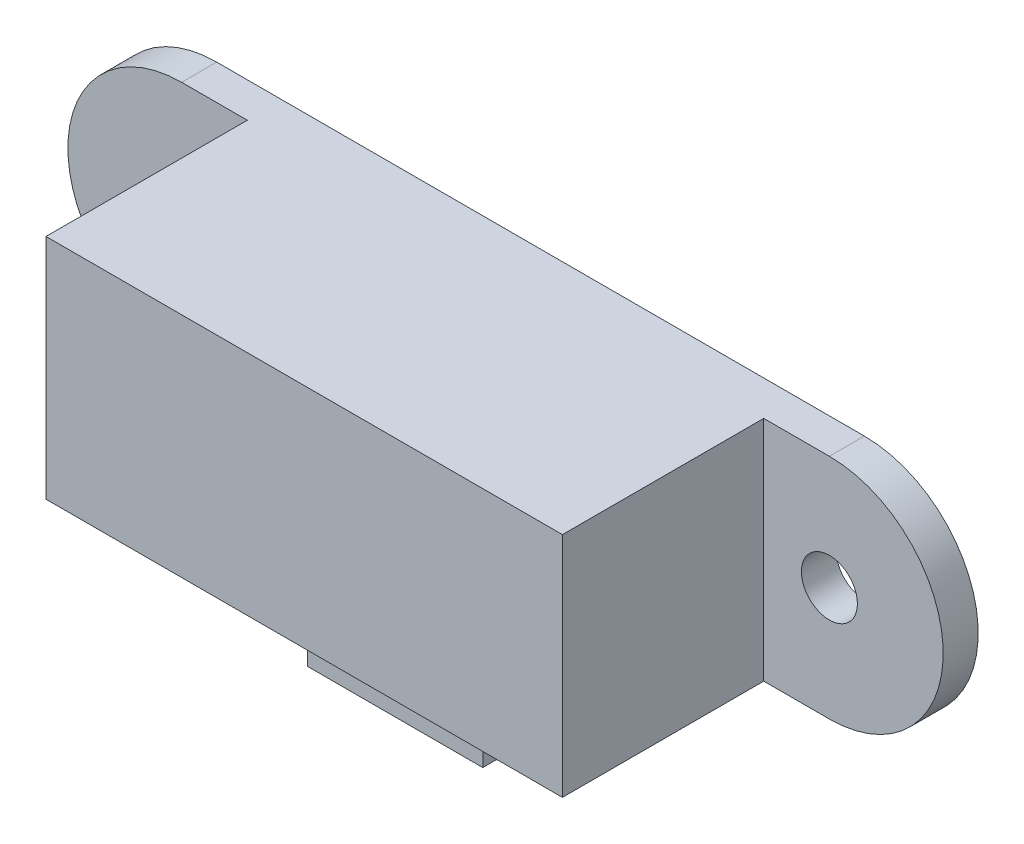
ISO-10303-21;
HEADER;
FILE_DESCRIPTION(('STEP AP214'),'2;1');
FILE_NAME('part.step','',(''),(''),'','','');
FILE_SCHEMA(('AUTOMOTIVE_DESIGN { 1 0 10303 214 1 1 1 1 }'));
ENDSEC;
DATA;
#1=APPLICATION_CONTEXT('core data for automotive mechanical design processes');
#2=APPLICATION_PROTOCOL_DEFINITION('international standard','automotive_design',2000,#1);
#3=PRODUCT_CONTEXT('',#1,'mechanical');
#4=PRODUCT('Part','Part','',(#3));
#5=PRODUCT_RELATED_PRODUCT_CATEGORY('part','',(#4));
#6=PRODUCT_DEFINITION_FORMATION('','',#4);
#7=PRODUCT_DEFINITION_CONTEXT('part definition',#1,'design');
#8=PRODUCT_DEFINITION('design','',#6,#7);
#9=PRODUCT_DEFINITION_SHAPE('','',#8);
#10=(LENGTH_UNIT() NAMED_UNIT(*) SI_UNIT(.MILLI.,.METRE.));
#11=(NAMED_UNIT(*) PLANE_ANGLE_UNIT() SI_UNIT($,.RADIAN.));
#12=(NAMED_UNIT(*) SI_UNIT($,.STERADIAN.) SOLID_ANGLE_UNIT());
#13=UNCERTAINTY_MEASURE_WITH_UNIT(LENGTH_MEASURE(1.E-05),#10,'distance_accuracy_value','');
#14=(GEOMETRIC_REPRESENTATION_CONTEXT(3) GLOBAL_UNCERTAINTY_ASSIGNED_CONTEXT((#13)) GLOBAL_UNIT_ASSIGNED_CONTEXT((#10,
#11,#12)) REPRESENTATION_CONTEXT('',''));
#15=CARTESIAN_POINT('',(0.,0.,0.));
#16=DIRECTION('',(0.,0.,1.));
#17=DIRECTION('',(1.,0.,0.));
#18=AXIS2_PLACEMENT_3D('',#15,#16,#17);
#19=CARTESIAN_POINT('',(-18.5,-6.5,2.));
#20=DIRECTION('',(0.,1.,0.));
#21=DIRECTION('',(0.,0.,1.));
#22=AXIS2_PLACEMENT_3D('',#19,#20,#21);
#23=PLANE('',#22);
#24=DIRECTION('',(1.,0.,0.));
#25=VECTOR('',#24,1.);
#26=CARTESIAN_POINT('',(-18.5,-6.5,0.));
#27=LINE('',#26,#25);
#28=CARTESIAN_POINT('',(-18.5,-6.5,0.));
#29=VERTEX_POINT('',#28);
#30=CARTESIAN_POINT('',(18.5,-6.5,0.));
#31=VERTEX_POINT('',#30);
#32=EDGE_CURVE('E238',#29,#31,#27,.T.);
#33=ORIENTED_EDGE('',*,*,#32,.T.);
#34=DIRECTION('',(0.,0.,-1.));
#35=VECTOR('',#34,1.);
#36=CARTESIAN_POINT('',(18.5,-6.5,2.));
#37=LINE('',#36,#35);
#38=CARTESIAN_POINT('',(18.5,-6.5,2.));
#39=VERTEX_POINT('',#38);
#40=EDGE_CURVE('E43',#39,#31,#37,.T.);
#41=ORIENTED_EDGE('',*,*,#40,.F.);
#42=DIRECTION('',(1.,0.,0.));
#43=VECTOR('',#42,1.);
#44=CARTESIAN_POINT('',(-18.5,-6.5,2.));
#45=LINE('',#44,#43);
#46=CARTESIAN_POINT('',(14.75,-6.5,2.));
#47=VERTEX_POINT('',#46);
#48=EDGE_CURVE('E214',#47,#39,#45,.T.);
#49=ORIENTED_EDGE('',*,*,#48,.F.);
#50=DIRECTION('',(0.,0.,-1.));
#51=VECTOR('',#50,1.);
#52=CARTESIAN_POINT('',(14.75,-6.5,13.5));
#53=LINE('',#52,#51);
#54=CARTESIAN_POINT('',(14.75,-6.5,13.5));
#55=VERTEX_POINT('',#54);
#56=EDGE_CURVE('E178',#55,#47,#53,.T.);
#57=ORIENTED_EDGE('',*,*,#56,.F.);
#58=DIRECTION('',(1.,0.,0.));
#59=VECTOR('',#58,1.);
#60=CARTESIAN_POINT('',(-14.75,-6.5,13.5));
#61=LINE('',#60,#59);
#62=CARTESIAN_POINT('',(-14.75,-6.5,13.5));
#63=VERTEX_POINT('',#62);
#64=EDGE_CURVE('E158',#63,#55,#61,.T.);
#65=ORIENTED_EDGE('',*,*,#64,.F.);
#66=DIRECTION('',(0.,0.,-1.));
#67=VECTOR('',#66,1.);
#68=CARTESIAN_POINT('',(-14.75,-6.5,13.5));
#69=LINE('',#68,#67);
#70=CARTESIAN_POINT('',(-14.75,-6.5,2.));
#71=VERTEX_POINT('',#70);
#72=EDGE_CURVE('E185',#63,#71,#69,.T.);
#73=ORIENTED_EDGE('',*,*,#72,.T.);
#74=CARTESIAN_POINT('',(-18.5,-6.5,2.));
#75=VERTEX_POINT('',#74);
#76=EDGE_CURVE('E224',#75,#71,#45,.T.);
#77=ORIENTED_EDGE('',*,*,#76,.F.);
#78=DIRECTION('',(0.,0.,-1.));
#79=VECTOR('',#78,1.);
#80=CARTESIAN_POINT('',(-18.5,-6.5,2.));
#81=LINE('',#80,#79);
#82=EDGE_CURVE('E11',#75,#29,#81,.T.);
#83=ORIENTED_EDGE('',*,*,#82,.T.);
#84=EDGE_LOOP('',(#33,#41,#49,#57,#65,#73,#77,#83));
#85=FACE_BOUND('',#84,.T.);
#86=DIRECTION('',(0.,0.,-1.));
#87=VECTOR('',#86,1.);
#88=CARTESIAN_POINT('',(-5.,-6.5,8.3));
#89=LINE('',#88,#87);
#90=CARTESIAN_POINT('',(-5.,-6.5,8.3));
#91=VERTEX_POINT('',#90);
#92=CARTESIAN_POINT('',(-5.,-6.5,3.3));
#93=VERTEX_POINT('',#92);
#94=EDGE_CURVE('E145',#91,#93,#89,.T.);
#95=ORIENTED_EDGE('',*,*,#94,.F.);
#96=DIRECTION('',(-1.,0.,0.));
#97=VECTOR('',#96,1.);
#98=CARTESIAN_POINT('',(-5.,-6.5,8.3));
#99=LINE('',#98,#97);
#100=CARTESIAN_POINT('',(5.,-6.5,8.3));
#101=VERTEX_POINT('',#100);
#102=EDGE_CURVE('E142',#101,#91,#99,.T.);
#103=ORIENTED_EDGE('',*,*,#102,.F.);
#104=DIRECTION('',(0.,0.,1.));
#105=VECTOR('',#104,1.);
#106=CARTESIAN_POINT('',(5.,-6.5,8.3));
#107=LINE('',#106,#105);
#108=CARTESIAN_POINT('',(5.,-6.5,3.3));
#109=VERTEX_POINT('',#108);
#110=EDGE_CURVE('E56',#109,#101,#107,.T.);
#111=ORIENTED_EDGE('',*,*,#110,.F.);
#112=DIRECTION('',(1.,0.,0.));
#113=VECTOR('',#112,1.);
#114=CARTESIAN_POINT('',(-5.,-6.5,3.3));
#115=LINE('',#114,#113);
#116=EDGE_CURVE('E51',#93,#109,#115,.T.);
#117=ORIENTED_EDGE('',*,*,#116,.F.);
#118=EDGE_LOOP('',(#95,#103,#111,#117));
#119=FACE_BOUND('',#118,.T.);
#120=ADVANCED_FACE('F34',(#85,#119),#23,.F.);
#121=CARTESIAN_POINT('',(-18.5,0.,2.));
#122=DIRECTION('',(0.,0.,1.));
#123=DIRECTION('',(1.,0.,0.));
#124=AXIS2_PLACEMENT_3D('',#121,#122,#123);
#125=PLANE('',#124);
#126=DIRECTION('',(0.,-1.,0.));
#127=VECTOR('',#126,1.);
#128=CARTESIAN_POINT('',(-14.75,6.5,2.));
#129=LINE('',#128,#127);
#130=CARTESIAN_POINT('',(-14.75,6.5,2.));
#131=VERTEX_POINT('',#130);
#132=EDGE_CURVE('E146',#131,#71,#129,.T.);
#133=ORIENTED_EDGE('',*,*,#132,.F.);
#134=DIRECTION('',(-1.,0.,0.));
#135=VECTOR('',#134,1.);
#136=CARTESIAN_POINT('',(18.5,6.5,2.));
#137=LINE('',#136,#135);
#138=CARTESIAN_POINT('',(-18.5,6.5,2.));
#139=VERTEX_POINT('',#138);
#140=EDGE_CURVE('E243',#131,#139,#137,.T.);
#141=ORIENTED_EDGE('',*,*,#140,.T.);
#142=CARTESIAN_POINT('',(-18.5,0.,2.));
#143=DIRECTION('',(0.,0.,1.));
#144=DIRECTION('',(1.,0.,0.));
#145=AXIS2_PLACEMENT_3D('',#142,#143,#144);
#146=CIRCLE('',#145,6.5);
#147=EDGE_CURVE('E211',#139,#75,#146,.T.);
#148=ORIENTED_EDGE('',*,*,#147,.T.);
#149=ORIENTED_EDGE('',*,*,#76,.T.);
#150=EDGE_LOOP('',(#133,#141,#148,#149));
#151=FACE_BOUND('',#150,.T.);
#152=CARTESIAN_POINT('',(-18.5,0.,2.));
#153=DIRECTION('',(0.,0.,1.));
#154=DIRECTION('',(1.,0.,0.));
#155=AXIS2_PLACEMENT_3D('',#152,#153,#154);
#156=CIRCLE('',#155,1.6);
#157=CARTESIAN_POINT('',(-16.9,0.,2.));
#158=VERTEX_POINT('',#157);
#159=EDGE_CURVE('E205',#158,#158,#156,.T.);
#160=ORIENTED_EDGE('',*,*,#159,.F.);
#161=EDGE_LOOP('',(#160));
#162=FACE_BOUND('',#161,.T.);
#163=ADVANCED_FACE('F273',(#151,#162),#125,.T.);
#164=DIRECTION('',(0.,1.,0.));
#165=VECTOR('',#164,1.);
#166=CARTESIAN_POINT('',(14.75,6.5,2.));
#167=LINE('',#166,#165);
#168=CARTESIAN_POINT('',(14.75,6.5,2.));
#169=VERTEX_POINT('',#168);
#170=EDGE_CURVE('E149',#47,#169,#167,.T.);
#171=ORIENTED_EDGE('',*,*,#170,.F.);
#172=ORIENTED_EDGE('',*,*,#48,.T.);
#173=CARTESIAN_POINT('',(18.5,0.,2.));
#174=DIRECTION('',(0.,0.,1.));
#175=DIRECTION('',(-1.,0.,0.));
#176=AXIS2_PLACEMENT_3D('',#173,#174,#175);
#177=CIRCLE('',#176,6.5);
#178=CARTESIAN_POINT('',(18.5,6.5,2.));
#179=VERTEX_POINT('',#178);
#180=EDGE_CURVE('E218',#39,#179,#177,.T.);
#181=ORIENTED_EDGE('',*,*,#180,.T.);
#182=EDGE_CURVE('E234',#179,#169,#137,.T.);
#183=ORIENTED_EDGE('',*,*,#182,.T.);
#184=EDGE_LOOP('',(#171,#172,#181,#183));
#185=FACE_BOUND('',#184,.T.);
#186=CARTESIAN_POINT('',(18.5,0.,2.));
#187=DIRECTION('',(0.,0.,1.));
#188=DIRECTION('',(1.,0.,0.));
#189=AXIS2_PLACEMENT_3D('',#186,#187,#188);
#190=CIRCLE('',#189,1.6);
#191=CARTESIAN_POINT('',(20.1,0.,2.));
#192=VERTEX_POINT('',#191);
#193=EDGE_CURVE('E198',#192,#192,#190,.T.);
#194=ORIENTED_EDGE('',*,*,#193,.F.);
#195=EDGE_LOOP('',(#194));
#196=FACE_BOUND('',#195,.T.);
#197=ADVANCED_FACE('F251',(#185,#196),#125,.T.);
#198=CARTESIAN_POINT('',(-18.5,0.,0.));
#199=DIRECTION('',(0.,0.,1.));
#200=DIRECTION('',(1.,0.,0.));
#201=AXIS2_PLACEMENT_3D('',#198,#199,#200);
#202=PLANE('',#201);
#203=CARTESIAN_POINT('',(-18.5,0.,0.));
#204=DIRECTION('',(0.,0.,1.));
#205=DIRECTION('',(1.,0.,0.));
#206=AXIS2_PLACEMENT_3D('',#203,#204,#205);
#207=CIRCLE('',#206,1.6);
#208=CARTESIAN_POINT('',(-16.9,0.,0.));
#209=VERTEX_POINT('',#208);
#210=EDGE_CURVE('E203',#209,#209,#207,.T.);
#211=ORIENTED_EDGE('',*,*,#210,.T.);
#212=EDGE_LOOP('',(#211));
#213=FACE_BOUND('',#212,.T.);
#214=CARTESIAN_POINT('',(-18.5,0.,0.));
#215=DIRECTION('',(0.,0.,1.));
#216=DIRECTION('',(1.,0.,0.));
#217=AXIS2_PLACEMENT_3D('',#214,#215,#216);
#218=CIRCLE('',#217,6.5);
#219=CARTESIAN_POINT('',(-18.5,6.5,0.));
#220=VERTEX_POINT('',#219);
#221=EDGE_CURVE('E208',#220,#29,#218,.T.);
#222=ORIENTED_EDGE('',*,*,#221,.F.);
#223=DIRECTION('',(-1.,0.,0.));
#224=VECTOR('',#223,1.);
#225=CARTESIAN_POINT('',(18.5,6.5,0.));
#226=LINE('',#225,#224);
#227=CARTESIAN_POINT('',(18.5,6.5,0.));
#228=VERTEX_POINT('',#227);
#229=EDGE_CURVE('E215',#228,#220,#226,.T.);
#230=ORIENTED_EDGE('',*,*,#229,.F.);
#231=CARTESIAN_POINT('',(18.5,0.,0.));
#232=DIRECTION('',(0.,0.,1.));
#233=DIRECTION('',(-1.,0.,0.));
#234=AXIS2_PLACEMENT_3D('',#231,#232,#233);
#235=CIRCLE('',#234,6.5);
#236=EDGE_CURVE('E236',#31,#228,#235,.T.);
#237=ORIENTED_EDGE('',*,*,#236,.F.);
#238=ORIENTED_EDGE('',*,*,#32,.F.);
#239=EDGE_LOOP('',(#222,#230,#237,#238));
#240=FACE_BOUND('',#239,.T.);
#241=CARTESIAN_POINT('',(18.5,0.,0.));
#242=DIRECTION('',(0.,0.,1.));
#243=DIRECTION('',(1.,0.,0.));
#244=AXIS2_PLACEMENT_3D('',#241,#242,#243);
#245=CIRCLE('',#244,1.6);
#246=CARTESIAN_POINT('',(20.1,0.,0.));
#247=VERTEX_POINT('',#246);
#248=EDGE_CURVE('E194',#247,#247,#245,.T.);
#249=ORIENTED_EDGE('',*,*,#248,.T.);
#250=EDGE_LOOP('',(#249));
#251=FACE_BOUND('',#250,.T.);
#252=ADVANCED_FACE('F319',(#213,#240,#251),#202,.F.);
#253=CARTESIAN_POINT('',(-18.5,0.,2.));
#254=DIRECTION('',(0.,0.,-1.));
#255=DIRECTION('',(-1.,0.,0.));
#256=AXIS2_PLACEMENT_3D('',#253,#254,#255);
#257=CYLINDRICAL_SURFACE('',#256,6.5);
#258=ORIENTED_EDGE('',*,*,#221,.T.);
#259=ORIENTED_EDGE('',*,*,#82,.F.);
#260=ORIENTED_EDGE('',*,*,#147,.F.);
#261=DIRECTION('',(0.,0.,-1.));
#262=VECTOR('',#261,1.);
#263=CARTESIAN_POINT('',(-18.5,6.5,2.));
#264=LINE('',#263,#262);
#265=EDGE_CURVE('E231',#139,#220,#264,.T.);
#266=ORIENTED_EDGE('',*,*,#265,.T.);
#267=EDGE_LOOP('',(#258,#259,#260,#266));
#268=FACE_BOUND('',#267,.T.);
#269=ADVANCED_FACE('F36',(#268),#257,.T.);
#270=CARTESIAN_POINT('',(18.5,0.,2.));
#271=DIRECTION('',(0.,0.,-1.));
#272=DIRECTION('',(-1.,0.,0.));
#273=AXIS2_PLACEMENT_3D('',#270,#271,#272);
#274=CYLINDRICAL_SURFACE('',#273,6.5);
#275=ORIENTED_EDGE('',*,*,#236,.T.);
#276=DIRECTION('',(0.,0.,-1.));
#277=VECTOR('',#276,1.);
#278=CARTESIAN_POINT('',(18.5,6.5,2.));
#279=LINE('',#278,#277);
#280=EDGE_CURVE('E228',#179,#228,#279,.T.);
#281=ORIENTED_EDGE('',*,*,#280,.F.);
#282=ORIENTED_EDGE('',*,*,#180,.F.);
#283=ORIENTED_EDGE('',*,*,#40,.T.);
#284=EDGE_LOOP('',(#275,#281,#282,#283));
#285=FACE_BOUND('',#284,.T.);
#286=ADVANCED_FACE('F256',(#285),#274,.T.);
#287=CARTESIAN_POINT('',(18.5,6.5,2.));
#288=DIRECTION('',(0.,-1.,0.));
#289=DIRECTION('',(0.,0.,-1.));
#290=AXIS2_PLACEMENT_3D('',#287,#288,#289);
#291=PLANE('',#290);
#292=ORIENTED_EDGE('',*,*,#229,.T.);
#293=ORIENTED_EDGE('',*,*,#265,.F.);
#294=ORIENTED_EDGE('',*,*,#140,.F.);
#295=DIRECTION('',(0.,0.,-1.));
#296=VECTOR('',#295,1.);
#297=CARTESIAN_POINT('',(-14.75,6.5,13.5));
#298=LINE('',#297,#296);
#299=CARTESIAN_POINT('',(-14.75,6.5,13.5));
#300=VERTEX_POINT('',#299);
#301=EDGE_CURVE('E164',#300,#131,#298,.T.);
#302=ORIENTED_EDGE('',*,*,#301,.F.);
#303=DIRECTION('',(-1.,0.,0.));
#304=VECTOR('',#303,1.);
#305=CARTESIAN_POINT('',(-14.75,6.5,13.5));
#306=LINE('',#305,#304);
#307=CARTESIAN_POINT('',(14.75,6.5,13.5));
#308=VERTEX_POINT('',#307);
#309=EDGE_CURVE('E162',#308,#300,#306,.T.);
#310=ORIENTED_EDGE('',*,*,#309,.F.);
#311=DIRECTION('',(0.,0.,-1.));
#312=VECTOR('',#311,1.);
#313=CARTESIAN_POINT('',(14.75,6.5,13.5));
#314=LINE('',#313,#312);
#315=EDGE_CURVE('E173',#308,#169,#314,.T.);
#316=ORIENTED_EDGE('',*,*,#315,.T.);
#317=ORIENTED_EDGE('',*,*,#182,.F.);
#318=ORIENTED_EDGE('',*,*,#280,.T.);
#319=EDGE_LOOP('',(#292,#293,#294,#302,#310,#316,#317,#318));
#320=FACE_BOUND('',#319,.T.);
#321=ADVANCED_FACE('F259',(#320),#291,.F.);
#322=CARTESIAN_POINT('',(-18.5,0.,2.));
#323=DIRECTION('',(0.,0.,-1.));
#324=DIRECTION('',(-1.,0.,0.));
#325=AXIS2_PLACEMENT_3D('',#322,#323,#324);
#326=CYLINDRICAL_SURFACE('',#325,1.6);
#327=ORIENTED_EDGE('',*,*,#159,.T.);
#328=EDGE_LOOP('',(#327));
#329=FACE_BOUND('',#328,.T.);
#330=ORIENTED_EDGE('',*,*,#210,.F.);
#331=EDGE_LOOP('',(#330));
#332=FACE_BOUND('',#331,.T.);
#333=ADVANCED_FACE('F261',(#329,#332),#326,.F.);
#334=CARTESIAN_POINT('',(18.5,0.,2.));
#335=DIRECTION('',(0.,0.,-1.));
#336=DIRECTION('',(-1.,0.,0.));
#337=AXIS2_PLACEMENT_3D('',#334,#335,#336);
#338=CYLINDRICAL_SURFACE('',#337,1.6);
#339=ORIENTED_EDGE('',*,*,#193,.T.);
#340=EDGE_LOOP('',(#339));
#341=FACE_BOUND('',#340,.T.);
#342=ORIENTED_EDGE('',*,*,#248,.F.);
#343=EDGE_LOOP('',(#342));
#344=FACE_BOUND('',#343,.T.);
#345=ADVANCED_FACE('F267',(#341,#344),#338,.F.);
#346=CARTESIAN_POINT('',(-14.75,6.5,13.5));
#347=DIRECTION('',(1.,0.,0.));
#348=DIRECTION('',(0.,1.,0.));
#349=AXIS2_PLACEMENT_3D('',#346,#347,#348);
#350=PLANE('',#349);
#351=ORIENTED_EDGE('',*,*,#132,.T.);
#352=ORIENTED_EDGE('',*,*,#72,.F.);
#353=DIRECTION('',(0.,-1.,0.));
#354=VECTOR('',#353,1.);
#355=CARTESIAN_POINT('',(-14.75,6.5,13.5));
#356=LINE('',#355,#354);
#357=EDGE_CURVE('E155',#300,#63,#356,.T.);
#358=ORIENTED_EDGE('',*,*,#357,.F.);
#359=ORIENTED_EDGE('',*,*,#301,.T.);
#360=EDGE_LOOP('',(#351,#352,#358,#359));
#361=FACE_BOUND('',#360,.T.);
#362=ADVANCED_FACE('F312',(#361),#350,.F.);
#363=CARTESIAN_POINT('',(14.75,6.5,13.5));
#364=DIRECTION('',(-1.,0.,0.));
#365=DIRECTION('',(0.,-1.,0.));
#366=AXIS2_PLACEMENT_3D('',#363,#364,#365);
#367=PLANE('',#366);
#368=ORIENTED_EDGE('',*,*,#170,.T.);
#369=ORIENTED_EDGE('',*,*,#315,.F.);
#370=DIRECTION('',(0.,1.,0.));
#371=VECTOR('',#370,1.);
#372=CARTESIAN_POINT('',(14.75,6.5,13.5));
#373=LINE('',#372,#371);
#374=EDGE_CURVE('E160',#55,#308,#373,.T.);
#375=ORIENTED_EDGE('',*,*,#374,.F.);
#376=ORIENTED_EDGE('',*,*,#56,.T.);
#377=EDGE_LOOP('',(#368,#369,#375,#376));
#378=FACE_BOUND('',#377,.T.);
#379=ADVANCED_FACE('F308',(#378),#367,.F.);
#380=CARTESIAN_POINT('',(-14.75,-6.5,13.5));
#381=DIRECTION('',(0.,0.,1.));
#382=DIRECTION('',(1.,0.,0.));
#383=AXIS2_PLACEMENT_3D('',#380,#381,#382);
#384=PLANE('',#383);
#385=ORIENTED_EDGE('',*,*,#357,.T.);
#386=ORIENTED_EDGE('',*,*,#64,.T.);
#387=ORIENTED_EDGE('',*,*,#374,.T.);
#388=ORIENTED_EDGE('',*,*,#309,.T.);
#389=EDGE_LOOP('',(#385,#386,#387,#388));
#390=FACE_BOUND('',#389,.T.);
#391=ADVANCED_FACE('F305',(#390),#384,.T.);
#392=CARTESIAN_POINT('',(-5.,-12.5,8.3));
#393=DIRECTION('',(1.,0.,0.));
#394=DIRECTION('',(0.,0.,-1.));
#395=AXIS2_PLACEMENT_3D('',#392,#393,#394);
#396=PLANE('',#395);
#397=ORIENTED_EDGE('',*,*,#94,.T.);
#398=DIRECTION('',(0.,1.,0.));
#399=VECTOR('',#398,1.);
#400=CARTESIAN_POINT('',(-5.,-12.5,3.3));
#401=LINE('',#400,#399);
#402=CARTESIAN_POINT('',(-5.,-12.5,3.3));
#403=VERTEX_POINT('',#402);
#404=EDGE_CURVE('E126',#403,#93,#401,.T.);
#405=ORIENTED_EDGE('',*,*,#404,.F.);
#406=DIRECTION('',(0.,0.,-1.));
#407=VECTOR('',#406,1.);
#408=CARTESIAN_POINT('',(-5.,-12.5,8.3));
#409=LINE('',#408,#407);
#410=CARTESIAN_POINT('',(-5.,-12.5,8.3));
#411=VERTEX_POINT('',#410);
#412=EDGE_CURVE('E133',#411,#403,#409,.T.);
#413=ORIENTED_EDGE('',*,*,#412,.F.);
#414=DIRECTION('',(0.,1.,0.));
#415=VECTOR('',#414,1.);
#416=CARTESIAN_POINT('',(-5.,-12.5,8.3));
#417=LINE('',#416,#415);
#418=EDGE_CURVE('E283',#411,#91,#417,.T.);
#419=ORIENTED_EDGE('',*,*,#418,.T.);
#420=EDGE_LOOP('',(#397,#405,#413,#419));
#421=FACE_BOUND('',#420,.T.);
#422=ADVANCED_FACE('F144',(#421),#396,.F.);
#423=CARTESIAN_POINT('',(-5.,-12.5,3.3));
#424=DIRECTION('',(0.,0.,1.));
#425=DIRECTION('',(1.,0.,0.));
#426=AXIS2_PLACEMENT_3D('',#423,#424,#425);
#427=PLANE('',#426);
#428=ORIENTED_EDGE('',*,*,#116,.T.);
#429=DIRECTION('',(0.,1.,0.));
#430=VECTOR('',#429,1.);
#431=CARTESIAN_POINT('',(5.,-12.5,3.3));
#432=LINE('',#431,#430);
#433=CARTESIAN_POINT('',(5.,-12.5,3.3));
#434=VERTEX_POINT('',#433);
#435=EDGE_CURVE('E129',#434,#109,#432,.T.);
#436=ORIENTED_EDGE('',*,*,#435,.F.);
#437=DIRECTION('',(1.,0.,0.));
#438=VECTOR('',#437,1.);
#439=CARTESIAN_POINT('',(-5.,-12.5,3.3));
#440=LINE('',#439,#438);
#441=EDGE_CURVE('E122',#403,#434,#440,.T.);
#442=ORIENTED_EDGE('',*,*,#441,.F.);
#443=ORIENTED_EDGE('',*,*,#404,.T.);
#444=EDGE_LOOP('',(#428,#436,#442,#443));
#445=FACE_BOUND('',#444,.T.);
#446=ADVANCED_FACE('F124',(#445),#427,.F.);
#447=CARTESIAN_POINT('',(5.,-12.5,8.3));
#448=DIRECTION('',(-1.,0.,0.));
#449=DIRECTION('',(0.,0.,1.));
#450=AXIS2_PLACEMENT_3D('',#447,#448,#449);
#451=PLANE('',#450);
#452=ORIENTED_EDGE('',*,*,#110,.T.);
#453=DIRECTION('',(0.,1.,0.));
#454=VECTOR('',#453,1.);
#455=CARTESIAN_POINT('',(5.,-12.5,8.3));
#456=LINE('',#455,#454);
#457=CARTESIAN_POINT('',(5.,-12.5,8.3));
#458=VERTEX_POINT('',#457);
#459=EDGE_CURVE('E151',#458,#101,#456,.T.);
#460=ORIENTED_EDGE('',*,*,#459,.F.);
#461=DIRECTION('',(0.,0.,1.));
#462=VECTOR('',#461,1.);
#463=CARTESIAN_POINT('',(5.,-12.5,8.3));
#464=LINE('',#463,#462);
#465=EDGE_CURVE('E132',#434,#458,#464,.T.);
#466=ORIENTED_EDGE('',*,*,#465,.F.);
#467=ORIENTED_EDGE('',*,*,#435,.T.);
#468=EDGE_LOOP('',(#452,#460,#466,#467));
#469=FACE_BOUND('',#468,.T.);
#470=ADVANCED_FACE('F292',(#469),#451,.F.);
#471=CARTESIAN_POINT('',(-5.,-12.5,8.3));
#472=DIRECTION('',(0.,0.,-1.));
#473=DIRECTION('',(-1.,0.,0.));
#474=AXIS2_PLACEMENT_3D('',#471,#472,#473);
#475=PLANE('',#474);
#476=ORIENTED_EDGE('',*,*,#102,.T.);
#477=ORIENTED_EDGE('',*,*,#418,.F.);
#478=DIRECTION('',(-1.,0.,0.));
#479=VECTOR('',#478,1.);
#480=CARTESIAN_POINT('',(-5.,-12.5,8.3));
#481=LINE('',#480,#479);
#482=EDGE_CURVE('E138',#458,#411,#481,.T.);
#483=ORIENTED_EDGE('',*,*,#482,.F.);
#484=ORIENTED_EDGE('',*,*,#459,.T.);
#485=EDGE_LOOP('',(#476,#477,#483,#484));
#486=FACE_BOUND('',#485,.T.);
#487=ADVANCED_FACE('F282',(#486),#475,.F.);
#488=CARTESIAN_POINT('',(-5.,-12.5,3.3));
#489=DIRECTION('',(0.,-1.,0.));
#490=DIRECTION('',(0.,0.,-1.));
#491=AXIS2_PLACEMENT_3D('',#488,#489,#490);
#492=PLANE('',#491);
#493=ORIENTED_EDGE('',*,*,#412,.T.);
#494=ORIENTED_EDGE('',*,*,#441,.T.);
#495=ORIENTED_EDGE('',*,*,#465,.T.);
#496=ORIENTED_EDGE('',*,*,#482,.T.);
#497=EDGE_LOOP('',(#493,#494,#495,#496));
#498=FACE_BOUND('',#497,.T.);
#499=ADVANCED_FACE('F136',(#498),#492,.T.);
#500=CLOSED_SHELL('',(#120,#163,#197,#252,#269,#286,#321,#333,#345,#362,#379,#391,#422,#446,
#470,#487,#499));
#501=MANIFOLD_SOLID_BREP('B2',#500);
#502=ADVANCED_BREP_SHAPE_REPRESENTATION('',(#18,#501),#14);
#503=SHAPE_DEFINITION_REPRESENTATION(#9,#502);
ENDSEC;
END-ISO-10303-21;
